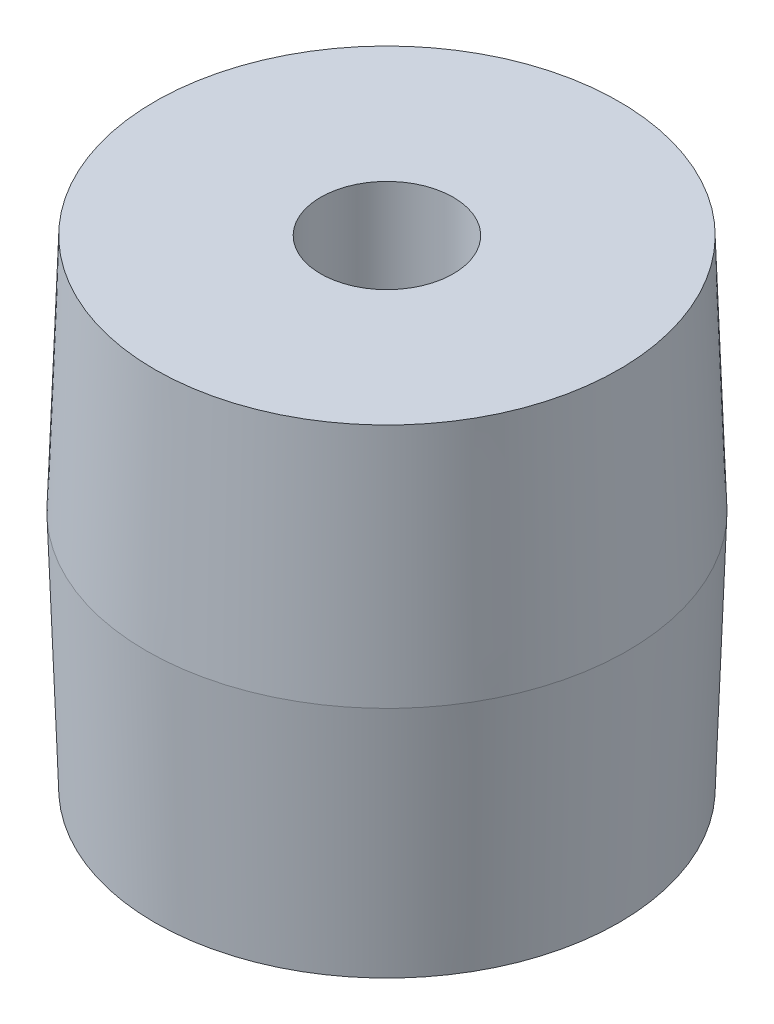
ISO-10303-21;
HEADER;
FILE_DESCRIPTION(('STEP AP214'),'2;1');
FILE_NAME('part.step','',(''),(''),'','','');
FILE_SCHEMA(('AUTOMOTIVE_DESIGN { 1 0 10303 214 1 1 1 1 }'));
ENDSEC;
DATA;
#1=APPLICATION_CONTEXT('core data for automotive mechanical design processes');
#2=APPLICATION_PROTOCOL_DEFINITION('international standard','automotive_design',2000,#1);
#3=PRODUCT_CONTEXT('',#1,'mechanical');
#4=PRODUCT('Part','Part','',(#3));
#5=PRODUCT_RELATED_PRODUCT_CATEGORY('part','',(#4));
#6=PRODUCT_DEFINITION_FORMATION('','',#4);
#7=PRODUCT_DEFINITION_CONTEXT('part definition',#1,'design');
#8=PRODUCT_DEFINITION('design','',#6,#7);
#9=PRODUCT_DEFINITION_SHAPE('','',#8);
#10=(LENGTH_UNIT() NAMED_UNIT(*) SI_UNIT(.MILLI.,.METRE.));
#11=(NAMED_UNIT(*) PLANE_ANGLE_UNIT() SI_UNIT($,.RADIAN.));
#12=(NAMED_UNIT(*) SI_UNIT($,.STERADIAN.) SOLID_ANGLE_UNIT());
#13=UNCERTAINTY_MEASURE_WITH_UNIT(LENGTH_MEASURE(1.E-05),#10,'distance_accuracy_value','');
#14=(GEOMETRIC_REPRESENTATION_CONTEXT(3) GLOBAL_UNCERTAINTY_ASSIGNED_CONTEXT((#13)) GLOBAL_UNIT_ASSIGNED_CONTEXT((#10,
#11,#12)) REPRESENTATION_CONTEXT('',''));
#15=CARTESIAN_POINT('',(0.,0.,0.));
#16=DIRECTION('',(0.,0.,1.));
#17=DIRECTION('',(1.,0.,0.));
#18=AXIS2_PLACEMENT_3D('',#15,#16,#17);
#19=CARTESIAN_POINT('',(0.,0.,0.));
#20=DIRECTION('',(0.,-1.,0.));
#21=DIRECTION('',(0.,0.,1.));
#22=AXIS2_PLACEMENT_3D('',#19,#20,#21);
#23=CONICAL_SURFACE('',#22,9.2075,0.0349065850398867);
#24=CARTESIAN_POINT('',(0.,9.1694,0.));
#25=DIRECTION('',(0.,1.,0.));
#26=DIRECTION('',(0.,0.,1.));
#27=AXIS2_PLACEMENT_3D('',#24,#25,#26);
#28=CIRCLE('',#27,8.88729749622237);
#29=CARTESIAN_POINT('',(0.,9.1694,8.88729749622237));
#30=VERTEX_POINT('',#29);
#31=EDGE_CURVE('E10',#30,#30,#28,.T.);
#32=ORIENTED_EDGE('',*,*,#31,.F.);
#33=EDGE_LOOP('',(#32));
#34=FACE_BOUND('',#33,.T.);
#35=CARTESIAN_POINT('',(0.,0.,0.));
#36=DIRECTION('',(0.,1.,0.));
#37=DIRECTION('',(0.,0.,1.));
#38=AXIS2_PLACEMENT_3D('',#35,#36,#37);
#39=CIRCLE('',#38,9.2075);
#40=CARTESIAN_POINT('',(0.,0.,9.2075));
#41=VERTEX_POINT('',#40);
#42=EDGE_CURVE('E41',#41,#41,#39,.T.);
#43=ORIENTED_EDGE('',*,*,#42,.T.);
#44=EDGE_LOOP('',(#43));
#45=FACE_BOUND('',#44,.T.);
#46=ADVANCED_FACE('F31',(#34,#45),#23,.T.);
#47=CARTESIAN_POINT('',(0.,9.1694,0.));
#48=DIRECTION('',(0.,1.,0.));
#49=DIRECTION('',(0.,0.,1.));
#50=AXIS2_PLACEMENT_3D('',#47,#48,#49);
#51=PLANE('',#50);
#52=CARTESIAN_POINT('',(0.,9.1694,0.));
#53=DIRECTION('',(0.,-1.,0.));
#54=DIRECTION('',(0.,0.,-1.));
#55=AXIS2_PLACEMENT_3D('',#52,#53,#54);
#56=CIRCLE('',#55,2.54);
#57=CARTESIAN_POINT('',(0.,9.1694,-2.54));
#58=VERTEX_POINT('',#57);
#59=EDGE_CURVE('E45',#58,#58,#56,.T.);
#60=ORIENTED_EDGE('',*,*,#59,.T.);
#61=EDGE_LOOP('',(#60));
#62=FACE_BOUND('',#61,.T.);
#63=ORIENTED_EDGE('',*,*,#31,.T.);
#64=EDGE_LOOP('',(#63));
#65=FACE_BOUND('',#64,.T.);
#66=ADVANCED_FACE('F54',(#62,#65),#51,.T.);
#67=CARTESIAN_POINT('',(0.,0.,0.));
#68=DIRECTION('',(0.,1.,0.));
#69=DIRECTION('',(0.,0.,1.));
#70=AXIS2_PLACEMENT_3D('',#67,#68,#69);
#71=CONICAL_SURFACE('',#70,9.2075,0.0349065850398867);
#72=CARTESIAN_POINT('',(0.,-9.1694,0.));
#73=DIRECTION('',(0.,-1.,0.));
#74=DIRECTION('',(0.,0.,-1.));
#75=AXIS2_PLACEMENT_3D('',#72,#73,#74);
#76=CIRCLE('',#75,8.88729749622237);
#77=CARTESIAN_POINT('',(0.,-9.1694,-8.88729749622237));
#78=VERTEX_POINT('',#77);
#79=EDGE_CURVE('E37',#78,#78,#76,.F.);
#80=ORIENTED_EDGE('',*,*,#79,.T.);
#81=EDGE_LOOP('',(#80));
#82=FACE_BOUND('',#81,.T.);
#83=ORIENTED_EDGE('',*,*,#42,.F.);
#84=EDGE_LOOP('',(#83));
#85=FACE_BOUND('',#84,.T.);
#86=ADVANCED_FACE('F65',(#82,#85),#71,.T.);
#87=CARTESIAN_POINT('',(0.,-9.1694,0.));
#88=DIRECTION('',(0.,-1.,0.));
#89=DIRECTION('',(0.,0.,1.));
#90=AXIS2_PLACEMENT_3D('',#87,#88,#89);
#91=PLANE('',#90);
#92=CARTESIAN_POINT('',(0.,-9.1694,0.));
#93=DIRECTION('',(0.,-1.,0.));
#94=DIRECTION('',(0.,0.,-1.));
#95=AXIS2_PLACEMENT_3D('',#92,#93,#94);
#96=CIRCLE('',#95,2.54);
#97=CARTESIAN_POINT('',(0.,-9.1694,-2.54));
#98=VERTEX_POINT('',#97);
#99=EDGE_CURVE('E48',#98,#98,#96,.T.);
#100=ORIENTED_EDGE('',*,*,#99,.F.);
#101=EDGE_LOOP('',(#100));
#102=FACE_BOUND('',#101,.T.);
#103=ORIENTED_EDGE('',*,*,#79,.F.);
#104=EDGE_LOOP('',(#103));
#105=FACE_BOUND('',#104,.T.);
#106=ADVANCED_FACE('F59',(#102,#105),#91,.T.);
#107=CARTESIAN_POINT('',(0.,9.1694,0.));
#108=DIRECTION('',(0.,-1.,0.));
#109=DIRECTION('',(0.,0.,-1.));
#110=AXIS2_PLACEMENT_3D('',#107,#108,#109);
#111=CYLINDRICAL_SURFACE('',#110,2.54);
#112=ORIENTED_EDGE('',*,*,#59,.F.);
#113=EDGE_LOOP('',(#112));
#114=FACE_BOUND('',#113,.T.);
#115=ORIENTED_EDGE('',*,*,#99,.T.);
#116=EDGE_LOOP('',(#115));
#117=FACE_BOUND('',#116,.T.);
#118=ADVANCED_FACE('F56',(#114,#117),#111,.F.);
#119=CLOSED_SHELL('',(#46,#66,#86,#106,#118));
#120=MANIFOLD_SOLID_BREP('B2',#119);
#121=ADVANCED_BREP_SHAPE_REPRESENTATION('',(#18,#120),#14);
#122=SHAPE_DEFINITION_REPRESENTATION(#9,#121);
ENDSEC;
END-ISO-10303-21;
